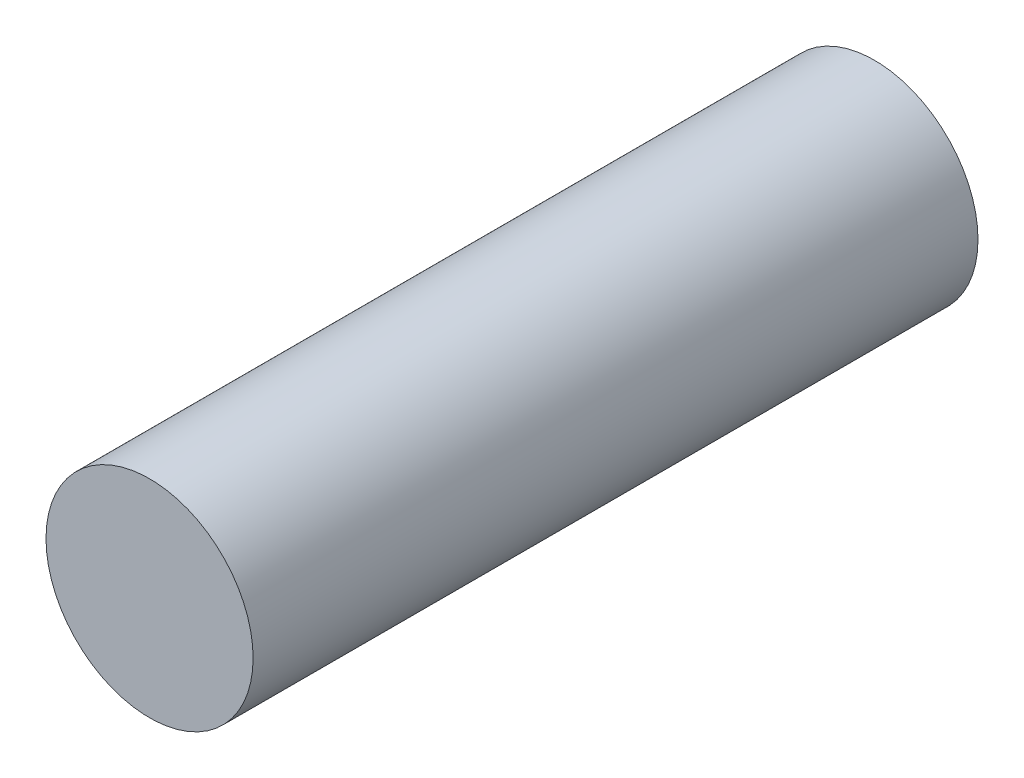
ISO-10303-21;
HEADER;
FILE_DESCRIPTION(('STEP AP214'),'2;1');
FILE_NAME('part.step','',(''),(''),'','','');
FILE_SCHEMA(('AUTOMOTIVE_DESIGN { 1 0 10303 214 1 1 1 1 }'));
ENDSEC;
DATA;
#1=APPLICATION_CONTEXT('core data for automotive mechanical design processes');
#2=APPLICATION_PROTOCOL_DEFINITION('international standard','automotive_design',2000,#1);
#3=PRODUCT_CONTEXT('',#1,'mechanical');
#4=PRODUCT('Part','Part','',(#3));
#5=PRODUCT_RELATED_PRODUCT_CATEGORY('part','',(#4));
#6=PRODUCT_DEFINITION_FORMATION('','',#4);
#7=PRODUCT_DEFINITION_CONTEXT('part definition',#1,'design');
#8=PRODUCT_DEFINITION('design','',#6,#7);
#9=PRODUCT_DEFINITION_SHAPE('','',#8);
#10=(LENGTH_UNIT() NAMED_UNIT(*) SI_UNIT(.MILLI.,.METRE.));
#11=(NAMED_UNIT(*) PLANE_ANGLE_UNIT() SI_UNIT($,.RADIAN.));
#12=(NAMED_UNIT(*) SI_UNIT($,.STERADIAN.) SOLID_ANGLE_UNIT());
#13=UNCERTAINTY_MEASURE_WITH_UNIT(LENGTH_MEASURE(1.E-05),#10,'distance_accuracy_value','');
#14=(GEOMETRIC_REPRESENTATION_CONTEXT(3) GLOBAL_UNCERTAINTY_ASSIGNED_CONTEXT((#13)) GLOBAL_UNIT_ASSIGNED_CONTEXT((#10,
#11,#12)) REPRESENTATION_CONTEXT('',''));
#15=CARTESIAN_POINT('',(0.,0.,0.));
#16=DIRECTION('',(0.,0.,1.));
#17=DIRECTION('',(1.,0.,0.));
#18=AXIS2_PLACEMENT_3D('',#15,#16,#17);
#19=CARTESIAN_POINT('',(0.,0.,35.));
#20=DIRECTION('',(0.,0.,-1.));
#21=DIRECTION('',(-1.,0.,0.));
#22=AXIS2_PLACEMENT_3D('',#19,#20,#21);
#23=CYLINDRICAL_SURFACE('',#22,5.);
#24=CARTESIAN_POINT('',(0.,0.,35.));
#25=DIRECTION('',(0.,0.,1.));
#26=DIRECTION('',(1.,0.,0.));
#27=AXIS2_PLACEMENT_3D('',#24,#25,#26);
#28=CIRCLE('',#27,5.);
#29=CARTESIAN_POINT('',(5.,0.,35.));
#30=VERTEX_POINT('',#29);
#31=EDGE_CURVE('E10',#30,#30,#28,.T.);
#32=ORIENTED_EDGE('',*,*,#31,.F.);
#33=EDGE_LOOP('',(#32));
#34=FACE_BOUND('',#33,.T.);
#35=CARTESIAN_POINT('',(0.,0.,0.));
#36=DIRECTION('',(0.,0.,1.));
#37=DIRECTION('',(1.,0.,0.));
#38=AXIS2_PLACEMENT_3D('',#35,#36,#37);
#39=CIRCLE('',#38,5.);
#40=CARTESIAN_POINT('',(5.,0.,0.));
#41=VERTEX_POINT('',#40);
#42=EDGE_CURVE('E34',#41,#41,#39,.T.);
#43=ORIENTED_EDGE('',*,*,#42,.T.);
#44=EDGE_LOOP('',(#43));
#45=FACE_BOUND('',#44,.T.);
#46=ADVANCED_FACE('F31',(#34,#45),#23,.T.);
#47=CARTESIAN_POINT('',(0.,0.,35.));
#48=DIRECTION('',(0.,0.,1.));
#49=DIRECTION('',(1.,0.,0.));
#50=AXIS2_PLACEMENT_3D('',#47,#48,#49);
#51=PLANE('',#50);
#52=ORIENTED_EDGE('',*,*,#31,.T.);
#53=EDGE_LOOP('',(#52));
#54=FACE_BOUND('',#53,.T.);
#55=ADVANCED_FACE('F46',(#54),#51,.T.);
#56=CARTESIAN_POINT('',(0.,0.,0.));
#57=DIRECTION('',(0.,0.,1.));
#58=DIRECTION('',(1.,0.,0.));
#59=AXIS2_PLACEMENT_3D('',#56,#57,#58);
#60=PLANE('',#59);
#61=ORIENTED_EDGE('',*,*,#42,.F.);
#62=EDGE_LOOP('',(#61));
#63=FACE_BOUND('',#62,.T.);
#64=ADVANCED_FACE('F44',(#63),#60,.F.);
#65=CLOSED_SHELL('',(#46,#55,#64));
#66=MANIFOLD_SOLID_BREP('B2',#65);
#67=ADVANCED_BREP_SHAPE_REPRESENTATION('',(#18,#66),#14);
#68=SHAPE_DEFINITION_REPRESENTATION(#9,#67);
ENDSEC;
END-ISO-10303-21;
